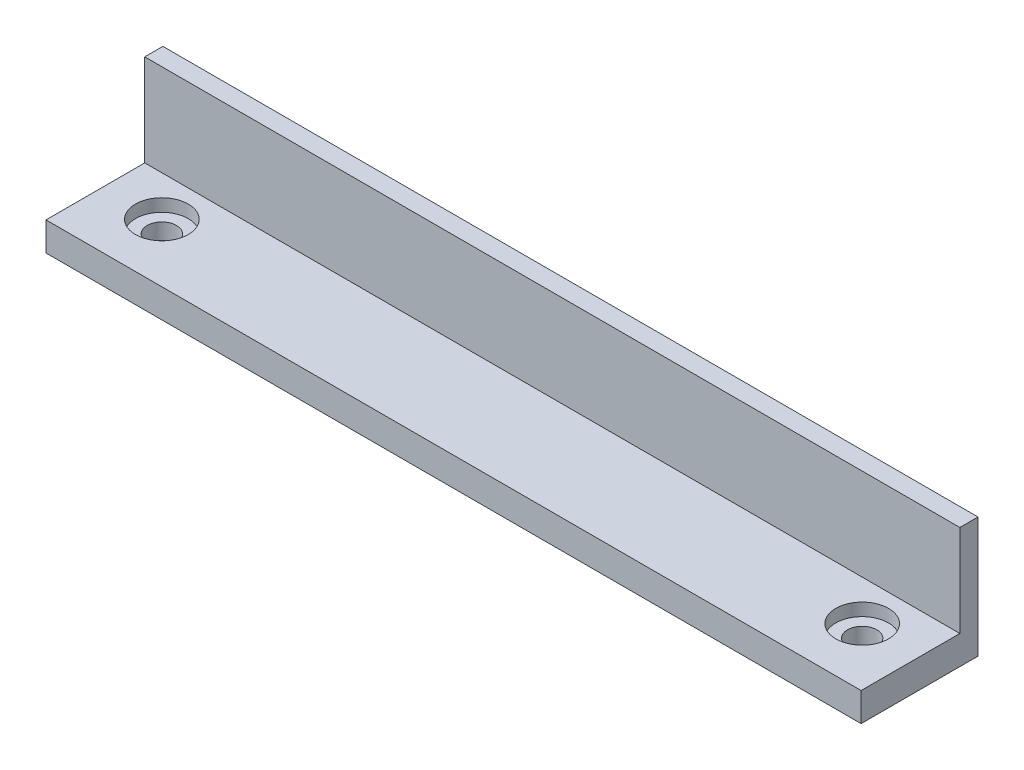
ISO-10303-21;
HEADER;
FILE_DESCRIPTION(('STEP AP214'),'2;1');
FILE_NAME('part.step','',(''),(''),'','','');
FILE_SCHEMA(('AUTOMOTIVE_DESIGN { 1 0 10303 214 1 1 1 1 }'));
ENDSEC;
DATA;
#1=APPLICATION_CONTEXT('core data for automotive mechanical design processes');
#2=APPLICATION_PROTOCOL_DEFINITION('international standard','automotive_design',2000,#1);
#3=PRODUCT_CONTEXT('',#1,'mechanical');
#4=PRODUCT('Part','Part','',(#3));
#5=PRODUCT_RELATED_PRODUCT_CATEGORY('part','',(#4));
#6=PRODUCT_DEFINITION_FORMATION('','',#4);
#7=PRODUCT_DEFINITION_CONTEXT('part definition',#1,'design');
#8=PRODUCT_DEFINITION('design','',#6,#7);
#9=PRODUCT_DEFINITION_SHAPE('','',#8);
#10=(LENGTH_UNIT() NAMED_UNIT(*) SI_UNIT(.MILLI.,.METRE.));
#11=(NAMED_UNIT(*) PLANE_ANGLE_UNIT() SI_UNIT($,.RADIAN.));
#12=(NAMED_UNIT(*) SI_UNIT($,.STERADIAN.) SOLID_ANGLE_UNIT());
#13=UNCERTAINTY_MEASURE_WITH_UNIT(LENGTH_MEASURE(1.E-05),#10,'distance_accuracy_value','');
#14=(GEOMETRIC_REPRESENTATION_CONTEXT(3) GLOBAL_UNCERTAINTY_ASSIGNED_CONTEXT((#13)) GLOBAL_UNIT_ASSIGNED_CONTEXT((#10,
#11,#12)) REPRESENTATION_CONTEXT('',''));
#15=CARTESIAN_POINT('',(0.,0.,0.));
#16=DIRECTION('',(0.,0.,1.));
#17=DIRECTION('',(1.,0.,0.));
#18=AXIS2_PLACEMENT_3D('',#15,#16,#17);
#19=CARTESIAN_POINT('',(-61.,5.,0.));
#20=DIRECTION('',(0.,-1.,0.));
#21=DIRECTION('',(0.,0.,-1.));
#22=AXIS2_PLACEMENT_3D('',#19,#20,#21);
#23=CYLINDRICAL_SURFACE('',#22,2.55);
#24=CARTESIAN_POINT('',(-61.,0.,0.));
#25=DIRECTION('',(0.,1.,0.));
#26=DIRECTION('',(0.,0.,1.));
#27=AXIS2_PLACEMENT_3D('',#24,#25,#26);
#28=CIRCLE('',#27,2.55);
#29=CARTESIAN_POINT('',(-61.,0.,2.55000000000001));
#30=VERTEX_POINT('',#29);
#31=EDGE_CURVE('E121',#30,#30,#28,.F.);
#32=ORIENTED_EDGE('',*,*,#31,.T.);
#33=EDGE_LOOP('',(#32));
#34=FACE_BOUND('',#33,.T.);
#35=CARTESIAN_POINT('',(-61.,2.8,0.));
#36=DIRECTION('',(0.,1.,0.));
#37=DIRECTION('',(0.,0.,1.));
#38=AXIS2_PLACEMENT_3D('',#35,#36,#37);
#39=CIRCLE('',#38,2.55);
#40=CARTESIAN_POINT('',(-61.,2.8,2.55000000000001));
#41=VERTEX_POINT('',#40);
#42=EDGE_CURVE('E171',#41,#41,#39,.T.);
#43=ORIENTED_EDGE('',*,*,#42,.T.);
#44=EDGE_LOOP('',(#43));
#45=FACE_BOUND('',#44,.T.);
#46=ADVANCED_FACE('F57',(#34,#45),#23,.F.);
#47=CARTESIAN_POINT('',(61.,5.,0.));
#48=DIRECTION('',(0.,-1.,0.));
#49=DIRECTION('',(0.,0.,-1.));
#50=AXIS2_PLACEMENT_3D('',#47,#48,#49);
#51=CYLINDRICAL_SURFACE('',#50,2.54999999999999);
#52=CARTESIAN_POINT('',(61.,0.,0.));
#53=DIRECTION('',(0.,1.,0.));
#54=DIRECTION('',(0.,0.,1.));
#55=AXIS2_PLACEMENT_3D('',#52,#53,#54);
#56=CIRCLE('',#55,2.54999999999999);
#57=CARTESIAN_POINT('',(61.,0.,2.54999999999999));
#58=VERTEX_POINT('',#57);
#59=EDGE_CURVE('E125',#58,#58,#56,.T.);
#60=ORIENTED_EDGE('',*,*,#59,.F.);
#61=EDGE_LOOP('',(#60));
#62=FACE_BOUND('',#61,.T.);
#63=CARTESIAN_POINT('',(61.,2.8,0.));
#64=DIRECTION('',(0.,1.,0.));
#65=DIRECTION('',(0.,0.,1.));
#66=AXIS2_PLACEMENT_3D('',#63,#64,#65);
#67=CIRCLE('',#66,2.54999999999999);
#68=CARTESIAN_POINT('',(61.,2.8,2.54999999999999));
#69=VERTEX_POINT('',#68);
#70=EDGE_CURVE('E168',#69,#69,#67,.T.);
#71=ORIENTED_EDGE('',*,*,#70,.T.);
#72=EDGE_LOOP('',(#71));
#73=FACE_BOUND('',#72,.T.);
#74=ADVANCED_FACE('F199',(#62,#73),#51,.F.);
#75=CARTESIAN_POINT('',(0.,5.,0.));
#76=DIRECTION('',(0.,1.,0.));
#77=DIRECTION('',(0.,0.,1.));
#78=AXIS2_PLACEMENT_3D('',#75,#76,#77);
#79=PLANE('',#78);
#80=CARTESIAN_POINT('',(-61.,5.,0.));
#81=DIRECTION('',(0.,1.,0.));
#82=DIRECTION('',(0.,0.,1.));
#83=AXIS2_PLACEMENT_3D('',#80,#81,#82);
#84=CIRCLE('',#83,4.6);
#85=CARTESIAN_POINT('',(-61.,5.,4.60000000000001));
#86=VERTEX_POINT('',#85);
#87=EDGE_CURVE('E174',#86,#86,#84,.T.);
#88=ORIENTED_EDGE('',*,*,#87,.F.);
#89=EDGE_LOOP('',(#88));
#90=FACE_BOUND('',#89,.T.);
#91=CARTESIAN_POINT('',(61.,5.,0.));
#92=DIRECTION('',(0.,1.,0.));
#93=DIRECTION('',(0.,0.,1.));
#94=AXIS2_PLACEMENT_3D('',#91,#92,#93);
#95=CIRCLE('',#94,4.6);
#96=CARTESIAN_POINT('',(61.,5.,4.59999999999999));
#97=VERTEX_POINT('',#96);
#98=EDGE_CURVE('E164',#97,#97,#95,.T.);
#99=ORIENTED_EDGE('',*,*,#98,.F.);
#100=EDGE_LOOP('',(#99));
#101=FACE_BOUND('',#100,.T.);
#102=DIRECTION('',(0.,0.,-1.));
#103=VECTOR('',#102,1.);
#104=CARTESIAN_POINT('',(71.,5.,0.));
#105=LINE('',#104,#103);
#106=CARTESIAN_POINT('',(71.,5.,10.18));
#107=VERTEX_POINT('',#106);
#108=CARTESIAN_POINT('',(71.,5.,-7.02));
#109=VERTEX_POINT('',#108);
#110=EDGE_CURVE('E145',#107,#109,#105,.T.);
#111=ORIENTED_EDGE('',*,*,#110,.T.);
#112=DIRECTION('',(-1.,0.,0.));
#113=VECTOR('',#112,1.);
#114=CARTESIAN_POINT('',(0.,5.,-7.02));
#115=LINE('',#114,#113);
#116=CARTESIAN_POINT('',(-71.,5.,-7.02));
#117=VERTEX_POINT('',#116);
#118=EDGE_CURVE('E153',#109,#117,#115,.T.);
#119=ORIENTED_EDGE('',*,*,#118,.T.);
#120=DIRECTION('',(0.,0.,-1.));
#121=VECTOR('',#120,1.);
#122=CARTESIAN_POINT('',(-71.,5.,0.));
#123=LINE('',#122,#121);
#124=CARTESIAN_POINT('',(-71.,5.,10.18));
#125=VERTEX_POINT('',#124);
#126=EDGE_CURVE('E106',#125,#117,#123,.T.);
#127=ORIENTED_EDGE('',*,*,#126,.F.);
#128=DIRECTION('',(1.,0.,0.));
#129=VECTOR('',#128,1.);
#130=CARTESIAN_POINT('',(0.,5.,10.18));
#131=LINE('',#130,#129);
#132=EDGE_CURVE('E103',#125,#107,#131,.T.);
#133=ORIENTED_EDGE('',*,*,#132,.T.);
#134=EDGE_LOOP('',(#111,#119,#127,#133));
#135=FACE_BOUND('',#134,.T.);
#136=ADVANCED_FACE('F196',(#90,#101,#135),#79,.T.);
#137=CARTESIAN_POINT('',(0.,5.,10.18));
#138=DIRECTION('',(0.,0.,-1.));
#139=DIRECTION('',(-1.,0.,0.));
#140=AXIS2_PLACEMENT_3D('',#137,#138,#139);
#141=PLANE('',#140);
#142=DIRECTION('',(1.,0.,0.));
#143=VECTOR('',#142,1.);
#144=CARTESIAN_POINT('',(0.,0.,10.18));
#145=LINE('',#144,#143);
#146=CARTESIAN_POINT('',(-71.,0.,10.18));
#147=VERTEX_POINT('',#146);
#148=CARTESIAN_POINT('',(71.,0.,10.18));
#149=VERTEX_POINT('',#148);
#150=EDGE_CURVE('E101',#147,#149,#145,.T.);
#151=ORIENTED_EDGE('',*,*,#150,.T.);
#152=DIRECTION('',(0.,-1.,0.));
#153=VECTOR('',#152,1.);
#154=CARTESIAN_POINT('',(71.,5.,10.18));
#155=LINE('',#154,#153);
#156=EDGE_CURVE('E12',#107,#149,#155,.T.);
#157=ORIENTED_EDGE('',*,*,#156,.F.);
#158=ORIENTED_EDGE('',*,*,#132,.F.);
#159=DIRECTION('',(0.,-1.,0.));
#160=VECTOR('',#159,1.);
#161=CARTESIAN_POINT('',(-71.,5.,10.18));
#162=LINE('',#161,#160);
#163=EDGE_CURVE('E81',#125,#147,#162,.T.);
#164=ORIENTED_EDGE('',*,*,#163,.T.);
#165=EDGE_LOOP('',(#151,#157,#158,#164));
#166=FACE_BOUND('',#165,.T.);
#167=ADVANCED_FACE('F59',(#166),#141,.F.);
#168=CARTESIAN_POINT('',(71.,5.,0.));
#169=DIRECTION('',(-1.,0.,0.));
#170=DIRECTION('',(0.,0.,1.));
#171=AXIS2_PLACEMENT_3D('',#168,#169,#170);
#172=PLANE('',#171);
#173=DIRECTION('',(0.,0.,-1.));
#174=VECTOR('',#173,1.);
#175=CARTESIAN_POINT('',(71.,0.,0.));
#176=LINE('',#175,#174);
#177=CARTESIAN_POINT('',(71.,0.,-10.18));
#178=VERTEX_POINT('',#177);
#179=EDGE_CURVE('E115',#149,#178,#176,.T.);
#180=ORIENTED_EDGE('',*,*,#179,.T.);
#181=DIRECTION('',(0.,-1.,0.));
#182=VECTOR('',#181,1.);
#183=CARTESIAN_POINT('',(71.,5.,-10.18));
#184=LINE('',#183,#182);
#185=CARTESIAN_POINT('',(71.,21.,-10.18));
#186=VERTEX_POINT('',#185);
#187=EDGE_CURVE('E65',#186,#178,#184,.T.);
#188=ORIENTED_EDGE('',*,*,#187,.F.);
#189=DIRECTION('',(0.,0.,1.));
#190=VECTOR('',#189,1.);
#191=CARTESIAN_POINT('',(71.,21.,0.));
#192=LINE('',#191,#190);
#193=CARTESIAN_POINT('',(71.,21.,-7.02));
#194=VERTEX_POINT('',#193);
#195=EDGE_CURVE('E158',#186,#194,#192,.T.);
#196=ORIENTED_EDGE('',*,*,#195,.T.);
#197=DIRECTION('',(0.,-1.,0.));
#198=VECTOR('',#197,1.);
#199=CARTESIAN_POINT('',(71.,21.,-7.02));
#200=LINE('',#199,#198);
#201=EDGE_CURVE('E150',#194,#109,#200,.T.);
#202=ORIENTED_EDGE('',*,*,#201,.T.);
#203=ORIENTED_EDGE('',*,*,#110,.F.);
#204=ORIENTED_EDGE('',*,*,#156,.T.);
#205=EDGE_LOOP('',(#180,#188,#196,#202,#203,#204));
#206=FACE_BOUND('',#205,.T.);
#207=ADVANCED_FACE('F142',(#206),#172,.F.);
#208=CARTESIAN_POINT('',(0.,5.,-10.18));
#209=DIRECTION('',(0.,0.,-1.));
#210=DIRECTION('',(-1.,0.,0.));
#211=AXIS2_PLACEMENT_3D('',#208,#209,#210);
#212=PLANE('',#211);
#213=DIRECTION('',(1.,0.,0.));
#214=VECTOR('',#213,1.);
#215=CARTESIAN_POINT('',(0.,0.,-10.18));
#216=LINE('',#215,#214);
#217=CARTESIAN_POINT('',(-71.,0.,-10.18));
#218=VERTEX_POINT('',#217);
#219=EDGE_CURVE('E122',#218,#178,#216,.T.);
#220=ORIENTED_EDGE('',*,*,#219,.F.);
#221=DIRECTION('',(0.,-1.,0.));
#222=VECTOR('',#221,1.);
#223=CARTESIAN_POINT('',(-71.,5.,-10.18));
#224=LINE('',#223,#222);
#225=CARTESIAN_POINT('',(-71.,21.,-10.18));
#226=VERTEX_POINT('',#225);
#227=EDGE_CURVE('E105',#226,#218,#224,.T.);
#228=ORIENTED_EDGE('',*,*,#227,.F.);
#229=DIRECTION('',(-1.,0.,0.));
#230=VECTOR('',#229,1.);
#231=CARTESIAN_POINT('',(0.,21.,-10.18));
#232=LINE('',#231,#230);
#233=EDGE_CURVE('E138',#186,#226,#232,.T.);
#234=ORIENTED_EDGE('',*,*,#233,.F.);
#235=ORIENTED_EDGE('',*,*,#187,.T.);
#236=EDGE_LOOP('',(#220,#228,#234,#235));
#237=FACE_BOUND('',#236,.T.);
#238=ADVANCED_FACE('F135',(#237),#212,.T.);
#239=CARTESIAN_POINT('',(-71.,5.,0.));
#240=DIRECTION('',(-1.,0.,0.));
#241=DIRECTION('',(0.,0.,1.));
#242=AXIS2_PLACEMENT_3D('',#239,#240,#241);
#243=PLANE('',#242);
#244=DIRECTION('',(0.,0.,-1.));
#245=VECTOR('',#244,1.);
#246=CARTESIAN_POINT('',(-71.,0.,0.));
#247=LINE('',#246,#245);
#248=EDGE_CURVE('E113',#147,#218,#247,.T.);
#249=ORIENTED_EDGE('',*,*,#248,.F.);
#250=ORIENTED_EDGE('',*,*,#163,.F.);
#251=ORIENTED_EDGE('',*,*,#126,.T.);
#252=DIRECTION('',(0.,-1.,0.));
#253=VECTOR('',#252,1.);
#254=CARTESIAN_POINT('',(-71.,21.,-7.02));
#255=LINE('',#254,#253);
#256=CARTESIAN_POINT('',(-71.,21.,-7.02));
#257=VERTEX_POINT('',#256);
#258=EDGE_CURVE('E72',#257,#117,#255,.T.);
#259=ORIENTED_EDGE('',*,*,#258,.F.);
#260=DIRECTION('',(0.,0.,1.));
#261=VECTOR('',#260,1.);
#262=CARTESIAN_POINT('',(-71.,21.,0.));
#263=LINE('',#262,#261);
#264=EDGE_CURVE('E155',#226,#257,#263,.T.);
#265=ORIENTED_EDGE('',*,*,#264,.F.);
#266=ORIENTED_EDGE('',*,*,#227,.T.);
#267=EDGE_LOOP('',(#249,#250,#251,#259,#265,#266));
#268=FACE_BOUND('',#267,.T.);
#269=ADVANCED_FACE('F117',(#268),#243,.T.);
#270=CARTESIAN_POINT('',(0.,0.,0.));
#271=DIRECTION('',(0.,1.,0.));
#272=DIRECTION('',(0.,0.,1.));
#273=AXIS2_PLACEMENT_3D('',#270,#271,#272);
#274=PLANE('',#273);
#275=ORIENTED_EDGE('',*,*,#150,.F.);
#276=ORIENTED_EDGE('',*,*,#248,.T.);
#277=ORIENTED_EDGE('',*,*,#219,.T.);
#278=ORIENTED_EDGE('',*,*,#179,.F.);
#279=EDGE_LOOP('',(#275,#276,#277,#278));
#280=FACE_BOUND('',#279,.T.);
#281=ORIENTED_EDGE('',*,*,#31,.F.);
#282=EDGE_LOOP('',(#281));
#283=FACE_BOUND('',#282,.T.);
#284=ORIENTED_EDGE('',*,*,#59,.T.);
#285=EDGE_LOOP('',(#284));
#286=FACE_BOUND('',#285,.T.);
#287=ADVANCED_FACE('F110',(#280,#283,#286),#274,.F.);
#288=CARTESIAN_POINT('',(0.,21.,-7.02));
#289=DIRECTION('',(0.,0.,1.));
#290=DIRECTION('',(1.,0.,0.));
#291=AXIS2_PLACEMENT_3D('',#288,#289,#290);
#292=PLANE('',#291);
#293=ORIENTED_EDGE('',*,*,#118,.F.);
#294=ORIENTED_EDGE('',*,*,#201,.F.);
#295=DIRECTION('',(-1.,0.,0.));
#296=VECTOR('',#295,1.);
#297=CARTESIAN_POINT('',(0.,21.,-7.02));
#298=LINE('',#297,#296);
#299=EDGE_CURVE('E160',#194,#257,#298,.T.);
#300=ORIENTED_EDGE('',*,*,#299,.T.);
#301=ORIENTED_EDGE('',*,*,#258,.T.);
#302=EDGE_LOOP('',(#293,#294,#300,#301));
#303=FACE_BOUND('',#302,.T.);
#304=ADVANCED_FACE('F208',(#303),#292,.T.);
#305=CARTESIAN_POINT('',(0.,21.,0.));
#306=DIRECTION('',(0.,-1.,0.));
#307=DIRECTION('',(0.,0.,-1.));
#308=AXIS2_PLACEMENT_3D('',#305,#306,#307);
#309=PLANE('',#308);
#310=ORIENTED_EDGE('',*,*,#264,.T.);
#311=ORIENTED_EDGE('',*,*,#299,.F.);
#312=ORIENTED_EDGE('',*,*,#195,.F.);
#313=ORIENTED_EDGE('',*,*,#233,.T.);
#314=EDGE_LOOP('',(#310,#311,#312,#313));
#315=FACE_BOUND('',#314,.T.);
#316=ADVANCED_FACE('F210',(#315),#309,.F.);
#317=CARTESIAN_POINT('',(61.,2.8,0.));
#318=DIRECTION('',(0.,1.,0.));
#319=DIRECTION('',(0.,0.,1.));
#320=AXIS2_PLACEMENT_3D('',#317,#318,#319);
#321=CYLINDRICAL_SURFACE('',#320,4.6);
#322=CARTESIAN_POINT('',(61.,2.8,0.));
#323=DIRECTION('',(0.,1.,0.));
#324=DIRECTION('',(0.,0.,1.));
#325=AXIS2_PLACEMENT_3D('',#322,#323,#324);
#326=CIRCLE('',#325,4.6);
#327=CARTESIAN_POINT('',(61.,2.8,4.59999999999999));
#328=VERTEX_POINT('',#327);
#329=EDGE_CURVE('E167',#328,#328,#326,.T.);
#330=ORIENTED_EDGE('',*,*,#329,.F.);
#331=EDGE_LOOP('',(#330));
#332=FACE_BOUND('',#331,.T.);
#333=ORIENTED_EDGE('',*,*,#98,.T.);
#334=EDGE_LOOP('',(#333));
#335=FACE_BOUND('',#334,.T.);
#336=ADVANCED_FACE('F216',(#332,#335),#321,.F.);
#337=CARTESIAN_POINT('',(61.,2.8,0.));
#338=DIRECTION('',(0.,1.,0.));
#339=DIRECTION('',(0.,0.,1.));
#340=AXIS2_PLACEMENT_3D('',#337,#338,#339);
#341=PLANE('',#340);
#342=ORIENTED_EDGE('',*,*,#70,.F.);
#343=EDGE_LOOP('',(#342));
#344=FACE_BOUND('',#343,.T.);
#345=ORIENTED_EDGE('',*,*,#329,.T.);
#346=EDGE_LOOP('',(#345));
#347=FACE_BOUND('',#346,.T.);
#348=ADVANCED_FACE('F192',(#344,#347),#341,.T.);
#349=CARTESIAN_POINT('',(-61.,2.8,0.));
#350=DIRECTION('',(0.,1.,0.));
#351=DIRECTION('',(0.,0.,1.));
#352=AXIS2_PLACEMENT_3D('',#349,#350,#351);
#353=CYLINDRICAL_SURFACE('',#352,4.6);
#354=CARTESIAN_POINT('',(-61.,2.8,0.));
#355=DIRECTION('',(0.,1.,0.));
#356=DIRECTION('',(0.,0.,1.));
#357=AXIS2_PLACEMENT_3D('',#354,#355,#356);
#358=CIRCLE('',#357,4.6);
#359=CARTESIAN_POINT('',(-61.,2.8,4.60000000000001));
#360=VERTEX_POINT('',#359);
#361=EDGE_CURVE('E156',#360,#360,#358,.T.);
#362=ORIENTED_EDGE('',*,*,#361,.F.);
#363=EDGE_LOOP('',(#362));
#364=FACE_BOUND('',#363,.T.);
#365=ORIENTED_EDGE('',*,*,#87,.T.);
#366=EDGE_LOOP('',(#365));
#367=FACE_BOUND('',#366,.T.);
#368=ADVANCED_FACE('F186',(#364,#367),#353,.F.);
#369=CARTESIAN_POINT('',(-61.,2.8,0.));
#370=DIRECTION('',(0.,1.,0.));
#371=DIRECTION('',(0.,0.,1.));
#372=AXIS2_PLACEMENT_3D('',#369,#370,#371);
#373=PLANE('',#372);
#374=ORIENTED_EDGE('',*,*,#42,.F.);
#375=EDGE_LOOP('',(#374));
#376=FACE_BOUND('',#375,.T.);
#377=ORIENTED_EDGE('',*,*,#361,.T.);
#378=EDGE_LOOP('',(#377));
#379=FACE_BOUND('',#378,.T.);
#380=ADVANCED_FACE('F183',(#376,#379),#373,.T.);
#381=CLOSED_SHELL('',(#46,#74,#136,#167,#207,#238,#269,#287,#304,#316,#336,#348,#368,#380));
#382=MANIFOLD_SOLID_BREP('B2',#381);
#383=ADVANCED_BREP_SHAPE_REPRESENTATION('',(#18,#382),#14);
#384=SHAPE_DEFINITION_REPRESENTATION(#9,#383);
ENDSEC;
END-ISO-10303-21;
